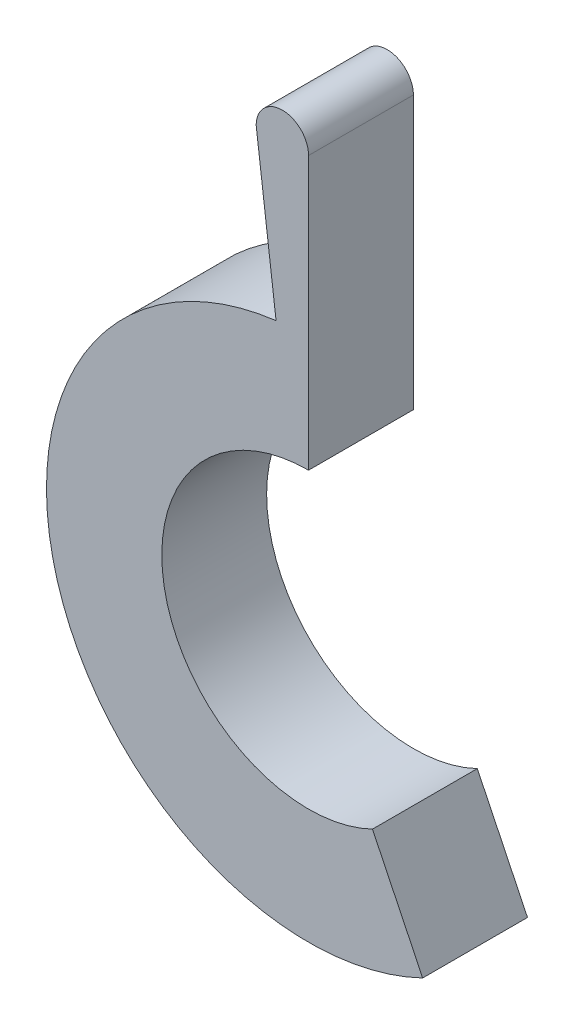
ISO-10303-21;
HEADER;
FILE_DESCRIPTION(('STEP AP214'),'2;1');
FILE_NAME('part.step','',(''),(''),'','','');
FILE_SCHEMA(('AUTOMOTIVE_DESIGN { 1 0 10303 214 1 1 1 1 }'));
ENDSEC;
DATA;
#1=APPLICATION_CONTEXT('core data for automotive mechanical design processes');
#2=APPLICATION_PROTOCOL_DEFINITION('international standard','automotive_design',2000,#1);
#3=PRODUCT_CONTEXT('',#1,'mechanical');
#4=PRODUCT('Part','Part','',(#3));
#5=PRODUCT_RELATED_PRODUCT_CATEGORY('part','',(#4));
#6=PRODUCT_DEFINITION_FORMATION('','',#4);
#7=PRODUCT_DEFINITION_CONTEXT('part definition',#1,'design');
#8=PRODUCT_DEFINITION('design','',#6,#7);
#9=PRODUCT_DEFINITION_SHAPE('','',#8);
#10=(LENGTH_UNIT() NAMED_UNIT(*) SI_UNIT(.MILLI.,.METRE.));
#11=(NAMED_UNIT(*) PLANE_ANGLE_UNIT() SI_UNIT($,.RADIAN.));
#12=(NAMED_UNIT(*) SI_UNIT($,.STERADIAN.) SOLID_ANGLE_UNIT());
#13=UNCERTAINTY_MEASURE_WITH_UNIT(LENGTH_MEASURE(1.E-05),#10,'distance_accuracy_value','');
#14=(GEOMETRIC_REPRESENTATION_CONTEXT(3) GLOBAL_UNCERTAINTY_ASSIGNED_CONTEXT((#13)) GLOBAL_UNIT_ASSIGNED_CONTEXT((#10,
#11,#12)) REPRESENTATION_CONTEXT('',''));
#15=CARTESIAN_POINT('',(0.,0.,0.));
#16=DIRECTION('',(0.,0.,1.));
#17=DIRECTION('',(1.,0.,0.));
#18=AXIS2_PLACEMENT_3D('',#15,#16,#17);
#19=CARTESIAN_POINT('',(0.,0.,10.));
#20=DIRECTION('',(0.,0.,-1.));
#21=DIRECTION('',(-1.,0.,0.));
#22=AXIS2_PLACEMENT_3D('',#19,#20,#21);
#23=CYLINDRICAL_SURFACE('',#22,14.);
#24=CARTESIAN_POINT('',(0.,0.,0.));
#25=DIRECTION('',(0.,0.,1.));
#26=DIRECTION('',(1.,0.,0.));
#27=AXIS2_PLACEMENT_3D('',#24,#25,#26);
#28=CIRCLE('',#27,14.);
#29=CARTESIAN_POINT('',(0.,14.,0.));
#30=VERTEX_POINT('',#29);
#31=CARTESIAN_POINT('',(6.09514029597005,-12.6035417550958,0.));
#32=VERTEX_POINT('',#31);
#33=EDGE_CURVE('E128',#30,#32,#28,.T.);
#34=ORIENTED_EDGE('',*,*,#33,.F.);
#35=DIRECTION('',(0.,0.,-1.));
#36=VECTOR('',#35,1.);
#37=CARTESIAN_POINT('',(0.,14.,10.));
#38=LINE('',#37,#36);
#39=CARTESIAN_POINT('',(0.,14.,10.));
#40=VERTEX_POINT('',#39);
#41=EDGE_CURVE('E11',#40,#30,#38,.T.);
#42=ORIENTED_EDGE('',*,*,#41,.F.);
#43=CARTESIAN_POINT('',(0.,0.,10.));
#44=DIRECTION('',(0.,0.,1.));
#45=DIRECTION('',(1.,0.,0.));
#46=AXIS2_PLACEMENT_3D('',#43,#44,#45);
#47=CIRCLE('',#46,14.);
#48=CARTESIAN_POINT('',(6.09514029597005,-12.6035417550958,10.));
#49=VERTEX_POINT('',#48);
#50=EDGE_CURVE('E147',#40,#49,#47,.T.);
#51=ORIENTED_EDGE('',*,*,#50,.T.);
#52=DIRECTION('',(0.,0.,-1.));
#53=VECTOR('',#52,1.);
#54=CARTESIAN_POINT('',(6.09514029597005,-12.6035417550958,10.));
#55=LINE('',#54,#53);
#56=EDGE_CURVE('E58',#49,#32,#55,.T.);
#57=ORIENTED_EDGE('',*,*,#56,.T.);
#58=EDGE_LOOP('',(#34,#42,#51,#57));
#59=FACE_BOUND('',#58,.T.);
#60=ADVANCED_FACE('F41',(#59),#23,.F.);
#61=CARTESIAN_POINT('',(0.,0.,10.));
#62=DIRECTION('',(1.,0.,0.));
#63=DIRECTION('',(0.,0.,-1.));
#64=AXIS2_PLACEMENT_3D('',#61,#62,#63);
#65=PLANE('',#64);
#66=DIRECTION('',(0.,-1.,0.));
#67=VECTOR('',#66,1.);
#68=CARTESIAN_POINT('',(0.,0.,0.));
#69=LINE('',#68,#67);
#70=CARTESIAN_POINT('',(0.,40.,0.));
#71=VERTEX_POINT('',#70);
#72=EDGE_CURVE('E131',#71,#30,#69,.T.);
#73=ORIENTED_EDGE('',*,*,#72,.F.);
#74=DIRECTION('',(0.,0.,-1.));
#75=VECTOR('',#74,1.);
#76=CARTESIAN_POINT('',(0.,40.,10.));
#77=LINE('',#76,#75);
#78=CARTESIAN_POINT('',(0.,40.,10.));
#79=VERTEX_POINT('',#78);
#80=EDGE_CURVE('E50',#79,#71,#77,.T.);
#81=ORIENTED_EDGE('',*,*,#80,.F.);
#82=DIRECTION('',(0.,-1.,0.));
#83=VECTOR('',#82,1.);
#84=CARTESIAN_POINT('',(0.,0.,10.));
#85=LINE('',#84,#83);
#86=EDGE_CURVE('E163',#79,#40,#85,.T.);
#87=ORIENTED_EDGE('',*,*,#86,.T.);
#88=ORIENTED_EDGE('',*,*,#41,.T.);
#89=EDGE_LOOP('',(#73,#81,#87,#88));
#90=FACE_BOUND('',#89,.T.);
#91=ADVANCED_FACE('F162',(#90),#65,.T.);
#92=CARTESIAN_POINT('',(-2.5,40.,10.));
#93=DIRECTION('',(0.,0.,-1.));
#94=DIRECTION('',(-1.,0.,0.));
#95=AXIS2_PLACEMENT_3D('',#92,#93,#94);
#96=CYLINDRICAL_SURFACE('',#95,2.5);
#97=CARTESIAN_POINT('',(-2.5,40.,0.));
#98=DIRECTION('',(0.,0.,1.));
#99=DIRECTION('',(1.,0.,0.));
#100=AXIS2_PLACEMENT_3D('',#97,#98,#99);
#101=CIRCLE('',#100,2.5);
#102=CARTESIAN_POINT('',(-5.,40.,0.));
#103=VERTEX_POINT('',#102);
#104=EDGE_CURVE('E135',#71,#103,#101,.T.);
#105=ORIENTED_EDGE('',*,*,#104,.T.);
#106=DIRECTION('',(0.,0.,-1.));
#107=VECTOR('',#106,1.);
#108=CARTESIAN_POINT('',(-5.,40.,10.));
#109=LINE('',#108,#107);
#110=CARTESIAN_POINT('',(-5.,40.,10.));
#111=VERTEX_POINT('',#110);
#112=EDGE_CURVE('E118',#111,#103,#109,.T.);
#113=ORIENTED_EDGE('',*,*,#112,.F.);
#114=CARTESIAN_POINT('',(-2.5,40.,10.));
#115=DIRECTION('',(0.,0.,1.));
#116=DIRECTION('',(1.,0.,0.));
#117=AXIS2_PLACEMENT_3D('',#114,#115,#116);
#118=CIRCLE('',#117,2.5);
#119=EDGE_CURVE('E104',#79,#111,#118,.T.);
#120=ORIENTED_EDGE('',*,*,#119,.F.);
#121=ORIENTED_EDGE('',*,*,#80,.T.);
#122=EDGE_LOOP('',(#105,#113,#120,#121));
#123=FACE_BOUND('',#122,.T.);
#124=ADVANCED_FACE('F156',(#123),#96,.T.);
#125=CARTESIAN_POINT('',(1.02418999781943E-13,0.,10.));
#126=DIRECTION('',(0.992277876713667,0.124034734589211,0.));
#127=DIRECTION('',(-0.124034734589211,0.992277876713667,0.));
#128=AXIS2_PLACEMENT_3D('',#125,#126,#127);
#129=PLANE('',#128);
#130=DIRECTION('',(0.124034734589211,-0.992277876713667,0.));
#131=VECTOR('',#130,1.);
#132=CARTESIAN_POINT('',(1.02418999781943E-13,0.,0.));
#133=LINE('',#132,#131);
#134=CARTESIAN_POINT('',(-3.10086836473017,24.8069469178417,0.));
#135=VERTEX_POINT('',#134);
#136=EDGE_CURVE('E114',#103,#135,#133,.T.);
#137=ORIENTED_EDGE('',*,*,#136,.T.);
#138=DIRECTION('',(0.,0.,-1.));
#139=VECTOR('',#138,1.);
#140=CARTESIAN_POINT('',(-3.10086836473017,24.8069469178417,10.));
#141=LINE('',#140,#139);
#142=CARTESIAN_POINT('',(-3.10086836473017,24.8069469178417,10.));
#143=VERTEX_POINT('',#142);
#144=EDGE_CURVE('E111',#143,#135,#141,.T.);
#145=ORIENTED_EDGE('',*,*,#144,.F.);
#146=DIRECTION('',(0.124034734589211,-0.992277876713667,0.));
#147=VECTOR('',#146,1.);
#148=CARTESIAN_POINT('',(1.02418999781943E-13,0.,10.));
#149=LINE('',#148,#147);
#150=EDGE_CURVE('E96',#111,#143,#149,.T.);
#151=ORIENTED_EDGE('',*,*,#150,.F.);
#152=ORIENTED_EDGE('',*,*,#112,.T.);
#153=EDGE_LOOP('',(#137,#145,#151,#152));
#154=FACE_BOUND('',#153,.T.);
#155=ADVANCED_FACE('F112',(#154),#129,.F.);
#156=CARTESIAN_POINT('',(0.,0.,10.));
#157=DIRECTION('',(0.,0.,-1.));
#158=DIRECTION('',(-1.,0.,0.));
#159=AXIS2_PLACEMENT_3D('',#156,#157,#158);
#160=CYLINDRICAL_SURFACE('',#159,25.);
#161=CARTESIAN_POINT('',(0.,0.,0.));
#162=DIRECTION('',(0.,0.,1.));
#163=DIRECTION('',(1.,0.,0.));
#164=AXIS2_PLACEMENT_3D('',#161,#162,#163);
#165=CIRCLE('',#164,25.);
#166=CARTESIAN_POINT('',(10.8841790999465,-22.506324562671,0.));
#167=VERTEX_POINT('',#166);
#168=EDGE_CURVE('E140',#135,#167,#165,.T.);
#169=ORIENTED_EDGE('',*,*,#168,.T.);
#170=DIRECTION('',(0.,0.,-1.));
#171=VECTOR('',#170,1.);
#172=CARTESIAN_POINT('',(10.8841790999465,-22.506324562671,10.));
#173=LINE('',#172,#171);
#174=CARTESIAN_POINT('',(10.8841790999465,-22.506324562671,10.));
#175=VERTEX_POINT('',#174);
#176=EDGE_CURVE('E78',#175,#167,#173,.T.);
#177=ORIENTED_EDGE('',*,*,#176,.F.);
#178=CARTESIAN_POINT('',(0.,0.,10.));
#179=DIRECTION('',(0.,0.,1.));
#180=DIRECTION('',(1.,0.,0.));
#181=AXIS2_PLACEMENT_3D('',#178,#179,#180);
#182=CIRCLE('',#181,25.);
#183=EDGE_CURVE('E101',#143,#175,#182,.T.);
#184=ORIENTED_EDGE('',*,*,#183,.F.);
#185=ORIENTED_EDGE('',*,*,#144,.T.);
#186=EDGE_LOOP('',(#169,#177,#184,#185));
#187=FACE_BOUND('',#186,.T.);
#188=ADVANCED_FACE('F120',(#187),#160,.T.);
#189=CARTESIAN_POINT('',(0.,0.,10.));
#190=DIRECTION('',(0.90025298250684,0.43536716399786,0.));
#191=DIRECTION('',(-0.43536716399786,0.90025298250684,0.));
#192=AXIS2_PLACEMENT_3D('',#189,#190,#191);
#193=PLANE('',#192);
#194=DIRECTION('',(0.43536716399786,-0.90025298250684,0.));
#195=VECTOR('',#194,1.);
#196=CARTESIAN_POINT('',(0.,0.,0.));
#197=LINE('',#196,#195);
#198=EDGE_CURVE('E143',#32,#167,#197,.T.);
#199=ORIENTED_EDGE('',*,*,#198,.F.);
#200=ORIENTED_EDGE('',*,*,#56,.F.);
#201=DIRECTION('',(0.43536716399786,-0.90025298250684,0.));
#202=VECTOR('',#201,1.);
#203=CARTESIAN_POINT('',(0.,0.,10.));
#204=LINE('',#203,#202);
#205=EDGE_CURVE('E122',#49,#175,#204,.T.);
#206=ORIENTED_EDGE('',*,*,#205,.T.);
#207=ORIENTED_EDGE('',*,*,#176,.T.);
#208=EDGE_LOOP('',(#199,#200,#206,#207));
#209=FACE_BOUND('',#208,.T.);
#210=ADVANCED_FACE('F164',(#209),#193,.T.);
#211=CARTESIAN_POINT('',(0.,0.,10.));
#212=DIRECTION('',(0.,0.,1.));
#213=DIRECTION('',(1.,0.,0.));
#214=AXIS2_PLACEMENT_3D('',#211,#212,#213);
#215=PLANE('',#214);
#216=ORIENTED_EDGE('',*,*,#50,.F.);
#217=ORIENTED_EDGE('',*,*,#86,.F.);
#218=ORIENTED_EDGE('',*,*,#119,.T.);
#219=ORIENTED_EDGE('',*,*,#150,.T.);
#220=ORIENTED_EDGE('',*,*,#183,.T.);
#221=ORIENTED_EDGE('',*,*,#205,.F.);
#222=EDGE_LOOP('',(#216,#217,#218,#219,#220,#221));
#223=FACE_BOUND('',#222,.T.);
#224=ADVANCED_FACE('F98',(#223),#215,.T.);
#225=CARTESIAN_POINT('',(0.,0.,0.));
#226=DIRECTION('',(0.,0.,1.));
#227=DIRECTION('',(1.,0.,0.));
#228=AXIS2_PLACEMENT_3D('',#225,#226,#227);
#229=PLANE('',#228);
#230=ORIENTED_EDGE('',*,*,#33,.T.);
#231=ORIENTED_EDGE('',*,*,#198,.T.);
#232=ORIENTED_EDGE('',*,*,#168,.F.);
#233=ORIENTED_EDGE('',*,*,#136,.F.);
#234=ORIENTED_EDGE('',*,*,#104,.F.);
#235=ORIENTED_EDGE('',*,*,#72,.T.);
#236=EDGE_LOOP('',(#230,#231,#232,#233,#234,#235));
#237=FACE_BOUND('',#236,.T.);
#238=ADVANCED_FACE('F161',(#237),#229,.F.);
#239=CLOSED_SHELL('',(#60,#91,#124,#155,#188,#210,#224,#238));
#240=MANIFOLD_SOLID_BREP('B2',#239);
#241=ADVANCED_BREP_SHAPE_REPRESENTATION('',(#18,#240),#14);
#242=SHAPE_DEFINITION_REPRESENTATION(#9,#241);
ENDSEC;
END-ISO-10303-21;
